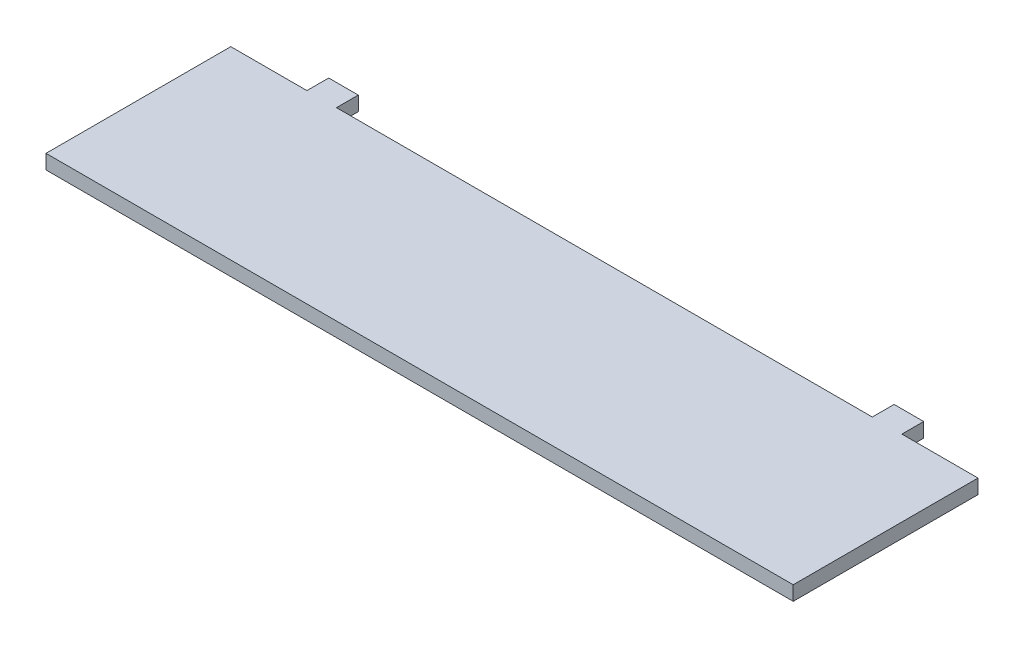
ISO-10303-21;
HEADER;
FILE_DESCRIPTION(('STEP AP214'),'2;1');
FILE_NAME('part.step','',(''),(''),'','','');
FILE_SCHEMA(('AUTOMOTIVE_DESIGN { 1 0 10303 214 1 1 1 1 }'));
ENDSEC;
DATA;
#1=APPLICATION_CONTEXT('core data for automotive mechanical design processes');
#2=APPLICATION_PROTOCOL_DEFINITION('international standard','automotive_design',2000,#1);
#3=PRODUCT_CONTEXT('',#1,'mechanical');
#4=PRODUCT('Part','Part','',(#3));
#5=PRODUCT_RELATED_PRODUCT_CATEGORY('part','',(#4));
#6=PRODUCT_DEFINITION_FORMATION('','',#4);
#7=PRODUCT_DEFINITION_CONTEXT('part definition',#1,'design');
#8=PRODUCT_DEFINITION('design','',#6,#7);
#9=PRODUCT_DEFINITION_SHAPE('','',#8);
#10=(LENGTH_UNIT() NAMED_UNIT(*) SI_UNIT(.MILLI.,.METRE.));
#11=(NAMED_UNIT(*) PLANE_ANGLE_UNIT() SI_UNIT($,.RADIAN.));
#12=(NAMED_UNIT(*) SI_UNIT($,.STERADIAN.) SOLID_ANGLE_UNIT());
#13=UNCERTAINTY_MEASURE_WITH_UNIT(LENGTH_MEASURE(1.E-05),#10,'distance_accuracy_value','');
#14=(GEOMETRIC_REPRESENTATION_CONTEXT(3) GLOBAL_UNCERTAINTY_ASSIGNED_CONTEXT((#13)) GLOBAL_UNIT_ASSIGNED_CONTEXT((#10,
#11,#12)) REPRESENTATION_CONTEXT('',''));
#15=CARTESIAN_POINT('',(0.,0.,0.));
#16=DIRECTION('',(0.,0.,1.));
#17=DIRECTION('',(1.,0.,0.));
#18=AXIS2_PLACEMENT_3D('',#15,#16,#17);
#19=CARTESIAN_POINT('',(-41.9913654357402,1.95,-16.3783260483283));
#20=DIRECTION('',(0.,0.,1.));
#21=DIRECTION('',(1.,0.,0.));
#22=AXIS2_PLACEMENT_3D('',#19,#20,#21);
#23=PLANE('',#22);
#24=DIRECTION('',(0.,1.,0.));
#25=VECTOR('',#24,1.);
#26=CARTESIAN_POINT('',(44.8021345642598,0.,-16.3783260483283));
#27=LINE('',#26,#25);
#28=CARTESIAN_POINT('',(44.8021345642598,0.,-16.3783260483283));
#29=VERTEX_POINT('',#28);
#30=CARTESIAN_POINT('',(44.8021345642598,1.95,-16.3783260483283));
#31=VERTEX_POINT('',#30);
#32=EDGE_CURVE('E155',#29,#31,#27,.T.);
#33=ORIENTED_EDGE('',*,*,#32,.F.);
#34=DIRECTION('',(-1.,0.,0.));
#35=VECTOR('',#34,1.);
#36=CARTESIAN_POINT('',(-41.9913654357402,0.,-16.3783260483283));
#37=LINE('',#36,#35);
#38=CARTESIAN_POINT('',(-27.6937448202683,0.,-16.3783260483283));
#39=VERTEX_POINT('',#38);
#40=EDGE_CURVE('E228',#29,#39,#37,.T.);
#41=ORIENTED_EDGE('',*,*,#40,.T.);
#42=DIRECTION('',(0.,-1.,0.));
#43=VECTOR('',#42,1.);
#44=CARTESIAN_POINT('',(-27.6937448202683,0.,-16.3783260483283));
#45=LINE('',#44,#43);
#46=CARTESIAN_POINT('',(-27.6937448202683,1.95,-16.3783260483283));
#47=VERTEX_POINT('',#46);
#48=EDGE_CURVE('E157',#47,#39,#45,.T.);
#49=ORIENTED_EDGE('',*,*,#48,.F.);
#50=DIRECTION('',(-1.,0.,0.));
#51=VECTOR('',#50,1.);
#52=CARTESIAN_POINT('',(-41.9913654357402,1.95,-16.3783260483283));
#53=LINE('',#52,#51);
#54=EDGE_CURVE('E55',#31,#47,#53,.T.);
#55=ORIENTED_EDGE('',*,*,#54,.F.);
#56=EDGE_LOOP('',(#33,#41,#49,#55));
#57=FACE_BOUND('',#56,.T.);
#58=ADVANCED_FACE('F39',(#57),#23,.F.);
#59=DIRECTION('',(0.,-1.,0.));
#60=VECTOR('',#59,1.);
#61=CARTESIAN_POINT('',(48.8021345642598,0.,-16.3783260483283));
#62=LINE('',#61,#60);
#63=CARTESIAN_POINT('',(48.8021345642598,1.95,-16.3783260483283));
#64=VERTEX_POINT('',#63);
#65=CARTESIAN_POINT('',(48.8021345642598,0.,-16.3783260483283));
#66=VERTEX_POINT('',#65);
#67=EDGE_CURVE('E63',#64,#66,#62,.T.);
#68=ORIENTED_EDGE('',*,*,#67,.F.);
#69=CARTESIAN_POINT('',(59.1006345642598,1.95,-16.3783260483283));
#70=VERTEX_POINT('',#69);
#71=EDGE_CURVE('E212',#70,#64,#53,.T.);
#72=ORIENTED_EDGE('',*,*,#71,.F.);
#73=DIRECTION('',(0.,-1.,0.));
#74=VECTOR('',#73,1.);
#75=CARTESIAN_POINT('',(59.1006345642598,1.95,-16.3783260483283));
#76=LINE('',#75,#74);
#77=CARTESIAN_POINT('',(59.1006345642598,0.,-16.3783260483283));
#78=VERTEX_POINT('',#77);
#79=EDGE_CURVE('E232',#70,#78,#76,.T.);
#80=ORIENTED_EDGE('',*,*,#79,.T.);
#81=EDGE_CURVE('E205',#78,#66,#37,.T.);
#82=ORIENTED_EDGE('',*,*,#81,.T.);
#83=EDGE_LOOP('',(#68,#72,#80,#82));
#84=FACE_BOUND('',#83,.T.);
#85=ADVANCED_FACE('F250',(#84),#23,.F.);
#86=DIRECTION('',(0.,1.,0.));
#87=VECTOR('',#86,1.);
#88=CARTESIAN_POINT('',(-31.6937448202683,0.,-16.3783260483283));
#89=LINE('',#88,#87);
#90=CARTESIAN_POINT('',(-31.6937448202683,0.,-16.3783260483283));
#91=VERTEX_POINT('',#90);
#92=CARTESIAN_POINT('',(-31.6937448202683,1.95,-16.3783260483283));
#93=VERTEX_POINT('',#92);
#94=EDGE_CURVE('E162',#91,#93,#89,.T.);
#95=ORIENTED_EDGE('',*,*,#94,.F.);
#96=CARTESIAN_POINT('',(-41.9913654357402,0.,-16.3783260483283));
#97=VERTEX_POINT('',#96);
#98=EDGE_CURVE('E225',#91,#97,#37,.T.);
#99=ORIENTED_EDGE('',*,*,#98,.T.);
#100=DIRECTION('',(0.,-1.,0.));
#101=VECTOR('',#100,1.);
#102=CARTESIAN_POINT('',(-41.9913654357402,1.95,-16.3783260483283));
#103=LINE('',#102,#101);
#104=CARTESIAN_POINT('',(-41.9913654357402,1.95,-16.3783260483283));
#105=VERTEX_POINT('',#104);
#106=EDGE_CURVE('E215',#105,#97,#103,.T.);
#107=ORIENTED_EDGE('',*,*,#106,.F.);
#108=EDGE_CURVE('E211',#93,#105,#53,.T.);
#109=ORIENTED_EDGE('',*,*,#108,.F.);
#110=EDGE_LOOP('',(#95,#99,#107,#109));
#111=FACE_BOUND('',#110,.T.);
#112=ADVANCED_FACE('F269',(#111),#23,.F.);
#113=CARTESIAN_POINT('',(-41.9913654357402,1.95,-16.3783260483283));
#114=DIRECTION('',(1.,0.,0.));
#115=DIRECTION('',(0.,0.,-1.));
#116=AXIS2_PLACEMENT_3D('',#113,#114,#115);
#117=PLANE('',#116);
#118=DIRECTION('',(0.,0.,1.));
#119=VECTOR('',#118,1.);
#120=CARTESIAN_POINT('',(-41.9913654357402,0.,-16.3783260483283));
#121=LINE('',#120,#119);
#122=CARTESIAN_POINT('',(-41.9913654357402,0.,8.62167395167169));
#123=VERTEX_POINT('',#122);
#124=EDGE_CURVE('E200',#97,#123,#121,.T.);
#125=ORIENTED_EDGE('',*,*,#124,.T.);
#126=DIRECTION('',(0.,-1.,0.));
#127=VECTOR('',#126,1.);
#128=CARTESIAN_POINT('',(-41.9913654357402,1.95,8.62167395167169));
#129=LINE('',#128,#127);
#130=CARTESIAN_POINT('',(-41.9913654357402,1.95,8.62167395167169));
#131=VERTEX_POINT('',#130);
#132=EDGE_CURVE('E11',#131,#123,#129,.T.);
#133=ORIENTED_EDGE('',*,*,#132,.F.);
#134=DIRECTION('',(0.,0.,1.));
#135=VECTOR('',#134,1.);
#136=CARTESIAN_POINT('',(-41.9913654357402,1.95,-16.3783260483283));
#137=LINE('',#136,#135);
#138=EDGE_CURVE('E201',#105,#131,#137,.T.);
#139=ORIENTED_EDGE('',*,*,#138,.F.);
#140=ORIENTED_EDGE('',*,*,#106,.T.);
#141=EDGE_LOOP('',(#125,#133,#139,#140));
#142=FACE_BOUND('',#141,.T.);
#143=ADVANCED_FACE('F41',(#142),#117,.F.);
#144=CARTESIAN_POINT('',(-41.9913654357402,1.95,8.62167395167169));
#145=DIRECTION('',(0.,0.,-1.));
#146=DIRECTION('',(-1.,0.,0.));
#147=AXIS2_PLACEMENT_3D('',#144,#145,#146);
#148=PLANE('',#147);
#149=DIRECTION('',(1.,0.,0.));
#150=VECTOR('',#149,1.);
#151=CARTESIAN_POINT('',(-41.9913654357402,0.,8.62167395167169));
#152=LINE('',#151,#150);
#153=CARTESIAN_POINT('',(59.1006345642598,0.,8.62167395167168));
#154=VERTEX_POINT('',#153);
#155=EDGE_CURVE('E219',#123,#154,#152,.T.);
#156=ORIENTED_EDGE('',*,*,#155,.T.);
#157=DIRECTION('',(0.,-1.,0.));
#158=VECTOR('',#157,1.);
#159=CARTESIAN_POINT('',(59.1006345642598,1.95,8.62167395167168));
#160=LINE('',#159,#158);
#161=CARTESIAN_POINT('',(59.1006345642598,1.95,8.62167395167168));
#162=VERTEX_POINT('',#161);
#163=EDGE_CURVE('E48',#162,#154,#160,.T.);
#164=ORIENTED_EDGE('',*,*,#163,.F.);
#165=DIRECTION('',(1.,0.,0.));
#166=VECTOR('',#165,1.);
#167=CARTESIAN_POINT('',(-41.9913654357402,1.95,8.62167395167169));
#168=LINE('',#167,#166);
#169=EDGE_CURVE('E204',#131,#162,#168,.T.);
#170=ORIENTED_EDGE('',*,*,#169,.F.);
#171=ORIENTED_EDGE('',*,*,#132,.T.);
#172=EDGE_LOOP('',(#156,#164,#170,#171));
#173=FACE_BOUND('',#172,.T.);
#174=ADVANCED_FACE('F280',(#173),#148,.F.);
#175=CARTESIAN_POINT('',(59.1006345642598,1.95,-16.3783260483283));
#176=DIRECTION('',(-1.,0.,0.));
#177=DIRECTION('',(0.,0.,1.));
#178=AXIS2_PLACEMENT_3D('',#175,#176,#177);
#179=PLANE('',#178);
#180=DIRECTION('',(0.,0.,-1.));
#181=VECTOR('',#180,1.);
#182=CARTESIAN_POINT('',(59.1006345642598,0.,-16.3783260483283));
#183=LINE('',#182,#181);
#184=EDGE_CURVE('E222',#154,#78,#183,.T.);
#185=ORIENTED_EDGE('',*,*,#184,.T.);
#186=ORIENTED_EDGE('',*,*,#79,.F.);
#187=DIRECTION('',(0.,0.,-1.));
#188=VECTOR('',#187,1.);
#189=CARTESIAN_POINT('',(59.1006345642598,1.95,-16.3783260483283));
#190=LINE('',#189,#188);
#191=EDGE_CURVE('E208',#162,#70,#190,.T.);
#192=ORIENTED_EDGE('',*,*,#191,.F.);
#193=ORIENTED_EDGE('',*,*,#163,.T.);
#194=EDGE_LOOP('',(#185,#186,#192,#193));
#195=FACE_BOUND('',#194,.T.);
#196=ADVANCED_FACE('F241',(#195),#179,.F.);
#197=CARTESIAN_POINT('',(0.,1.95,0.));
#198=DIRECTION('',(0.,1.,0.));
#199=DIRECTION('',(0.,0.,1.));
#200=AXIS2_PLACEMENT_3D('',#197,#198,#199);
#201=PLANE('',#200);
#202=ORIENTED_EDGE('',*,*,#138,.T.);
#203=ORIENTED_EDGE('',*,*,#169,.T.);
#204=ORIENTED_EDGE('',*,*,#191,.T.);
#205=ORIENTED_EDGE('',*,*,#71,.T.);
#206=DIRECTION('',(0.,0.,1.));
#207=VECTOR('',#206,1.);
#208=CARTESIAN_POINT('',(48.8021345642598,1.95,-19.3283260483283));
#209=LINE('',#208,#207);
#210=CARTESIAN_POINT('',(48.8021345642598,1.95,-19.3283260483283));
#211=VERTEX_POINT('',#210);
#212=EDGE_CURVE('E138',#211,#64,#209,.T.);
#213=ORIENTED_EDGE('',*,*,#212,.F.);
#214=DIRECTION('',(1.,0.,0.));
#215=VECTOR('',#214,1.);
#216=CARTESIAN_POINT('',(44.8021345642598,1.95,-19.3283260483283));
#217=LINE('',#216,#215);
#218=CARTESIAN_POINT('',(44.8021345642598,1.95,-19.3283260483283));
#219=VERTEX_POINT('',#218);
#220=EDGE_CURVE('E130',#219,#211,#217,.T.);
#221=ORIENTED_EDGE('',*,*,#220,.F.);
#222=DIRECTION('',(0.,0.,1.));
#223=VECTOR('',#222,1.);
#224=CARTESIAN_POINT('',(44.8021345642598,1.95,-19.3283260483283));
#225=LINE('',#224,#223);
#226=EDGE_CURVE('E135',#219,#31,#225,.T.);
#227=ORIENTED_EDGE('',*,*,#226,.T.);
#228=ORIENTED_EDGE('',*,*,#54,.T.);
#229=DIRECTION('',(0.,0.,1.));
#230=VECTOR('',#229,1.);
#231=CARTESIAN_POINT('',(-27.6937448202683,1.95,-19.3283260483283));
#232=LINE('',#231,#230);
#233=CARTESIAN_POINT('',(-27.6937448202683,1.95,-19.3283260483283));
#234=VERTEX_POINT('',#233);
#235=EDGE_CURVE('E180',#234,#47,#232,.T.);
#236=ORIENTED_EDGE('',*,*,#235,.F.);
#237=DIRECTION('',(1.,0.,0.));
#238=VECTOR('',#237,1.);
#239=CARTESIAN_POINT('',(-27.6937448202683,1.95,-19.3283260483283));
#240=LINE('',#239,#238);
#241=CARTESIAN_POINT('',(-31.6937448202683,1.95,-19.3283260483283));
#242=VERTEX_POINT('',#241);
#243=EDGE_CURVE('E178',#242,#234,#240,.T.);
#244=ORIENTED_EDGE('',*,*,#243,.F.);
#245=DIRECTION('',(0.,0.,1.));
#246=VECTOR('',#245,1.);
#247=CARTESIAN_POINT('',(-31.6937448202683,1.95,-19.3283260483283));
#248=LINE('',#247,#246);
#249=EDGE_CURVE('E188',#242,#93,#248,.T.);
#250=ORIENTED_EDGE('',*,*,#249,.T.);
#251=ORIENTED_EDGE('',*,*,#108,.T.);
#252=EDGE_LOOP('',(#202,#203,#204,#205,#213,#221,#227,#228,#236,#244,#250,#251));
#253=FACE_BOUND('',#252,.T.);
#254=ADVANCED_FACE('F133',(#253),#201,.T.);
#255=CARTESIAN_POINT('',(0.,0.,0.));
#256=DIRECTION('',(0.,1.,0.));
#257=DIRECTION('',(0.,0.,1.));
#258=AXIS2_PLACEMENT_3D('',#255,#256,#257);
#259=PLANE('',#258);
#260=ORIENTED_EDGE('',*,*,#124,.F.);
#261=ORIENTED_EDGE('',*,*,#98,.F.);
#262=DIRECTION('',(0.,0.,1.));
#263=VECTOR('',#262,1.);
#264=CARTESIAN_POINT('',(-31.6937448202683,0.,-19.3283260483283));
#265=LINE('',#264,#263);
#266=CARTESIAN_POINT('',(-31.6937448202683,0.,-19.3283260483283));
#267=VERTEX_POINT('',#266);
#268=EDGE_CURVE('E192',#267,#91,#265,.T.);
#269=ORIENTED_EDGE('',*,*,#268,.F.);
#270=DIRECTION('',(-1.,0.,0.));
#271=VECTOR('',#270,1.);
#272=CARTESIAN_POINT('',(-27.6937448202683,0.,-19.3283260483283));
#273=LINE('',#272,#271);
#274=CARTESIAN_POINT('',(-27.6937448202683,0.,-19.3283260483283));
#275=VERTEX_POINT('',#274);
#276=EDGE_CURVE('E172',#275,#267,#273,.T.);
#277=ORIENTED_EDGE('',*,*,#276,.F.);
#278=DIRECTION('',(0.,0.,1.));
#279=VECTOR('',#278,1.);
#280=CARTESIAN_POINT('',(-27.6937448202683,0.,-19.3283260483283));
#281=LINE('',#280,#279);
#282=EDGE_CURVE('E196',#275,#39,#281,.T.);
#283=ORIENTED_EDGE('',*,*,#282,.T.);
#284=ORIENTED_EDGE('',*,*,#40,.F.);
#285=DIRECTION('',(0.,0.,1.));
#286=VECTOR('',#285,1.);
#287=CARTESIAN_POINT('',(44.8021345642598,0.,-19.3283260483283));
#288=LINE('',#287,#286);
#289=CARTESIAN_POINT('',(44.8021345642598,0.,-19.3283260483283));
#290=VERTEX_POINT('',#289);
#291=EDGE_CURVE('E259',#290,#29,#288,.T.);
#292=ORIENTED_EDGE('',*,*,#291,.F.);
#293=DIRECTION('',(-1.,0.,0.));
#294=VECTOR('',#293,1.);
#295=CARTESIAN_POINT('',(44.8021345642598,0.,-19.3283260483283));
#296=LINE('',#295,#294);
#297=CARTESIAN_POINT('',(48.8021345642598,0.,-19.3283260483283));
#298=VERTEX_POINT('',#297);
#299=EDGE_CURVE('E148',#298,#290,#296,.T.);
#300=ORIENTED_EDGE('',*,*,#299,.F.);
#301=DIRECTION('',(0.,0.,1.));
#302=VECTOR('',#301,1.);
#303=CARTESIAN_POINT('',(48.8021345642598,0.,-19.3283260483283));
#304=LINE('',#303,#302);
#305=EDGE_CURVE('E164',#298,#66,#304,.T.);
#306=ORIENTED_EDGE('',*,*,#305,.T.);
#307=ORIENTED_EDGE('',*,*,#81,.F.);
#308=ORIENTED_EDGE('',*,*,#184,.F.);
#309=ORIENTED_EDGE('',*,*,#155,.F.);
#310=EDGE_LOOP('',(#260,#261,#269,#277,#283,#284,#292,#300,#306,#307,#308,#309));
#311=FACE_BOUND('',#310,.T.);
#312=ADVANCED_FACE('F247',(#311),#259,.F.);
#313=CARTESIAN_POINT('',(-27.6937448202683,0.,-19.3283260483283));
#314=DIRECTION('',(-1.,0.,0.));
#315=DIRECTION('',(0.,-1.,0.));
#316=AXIS2_PLACEMENT_3D('',#313,#314,#315);
#317=PLANE('',#316);
#318=ORIENTED_EDGE('',*,*,#48,.T.);
#319=ORIENTED_EDGE('',*,*,#282,.F.);
#320=DIRECTION('',(0.,-1.,0.));
#321=VECTOR('',#320,1.);
#322=CARTESIAN_POINT('',(-27.6937448202683,0.,-19.3283260483283));
#323=LINE('',#322,#321);
#324=EDGE_CURVE('E168',#234,#275,#323,.T.);
#325=ORIENTED_EDGE('',*,*,#324,.F.);
#326=ORIENTED_EDGE('',*,*,#235,.T.);
#327=EDGE_LOOP('',(#318,#319,#325,#326));
#328=FACE_BOUND('',#327,.T.);
#329=ADVANCED_FACE('F296',(#328),#317,.F.);
#330=CARTESIAN_POINT('',(-31.6937448202683,0.,-19.3283260483283));
#331=DIRECTION('',(1.,0.,0.));
#332=DIRECTION('',(0.,0.,-1.));
#333=AXIS2_PLACEMENT_3D('',#330,#331,#332);
#334=PLANE('',#333);
#335=ORIENTED_EDGE('',*,*,#94,.T.);
#336=ORIENTED_EDGE('',*,*,#249,.F.);
#337=DIRECTION('',(0.,1.,0.));
#338=VECTOR('',#337,1.);
#339=CARTESIAN_POINT('',(-31.6937448202683,0.,-19.3283260483283));
#340=LINE('',#339,#338);
#341=EDGE_CURVE('E175',#267,#242,#340,.T.);
#342=ORIENTED_EDGE('',*,*,#341,.F.);
#343=ORIENTED_EDGE('',*,*,#268,.T.);
#344=EDGE_LOOP('',(#335,#336,#342,#343));
#345=FACE_BOUND('',#344,.T.);
#346=ADVANCED_FACE('F289',(#345),#334,.F.);
#347=CARTESIAN_POINT('',(0.,0.,-19.3283260483283));
#348=DIRECTION('',(0.,0.,1.));
#349=DIRECTION('',(1.,0.,0.));
#350=AXIS2_PLACEMENT_3D('',#347,#348,#349);
#351=PLANE('',#350);
#352=ORIENTED_EDGE('',*,*,#324,.T.);
#353=ORIENTED_EDGE('',*,*,#276,.T.);
#354=ORIENTED_EDGE('',*,*,#341,.T.);
#355=ORIENTED_EDGE('',*,*,#243,.T.);
#356=EDGE_LOOP('',(#352,#353,#354,#355));
#357=FACE_BOUND('',#356,.T.);
#358=ADVANCED_FACE('F292',(#357),#351,.F.);
#359=CARTESIAN_POINT('',(44.8021345642598,0.,-19.3283260483283));
#360=DIRECTION('',(1.,0.,0.));
#361=DIRECTION('',(0.,0.,-1.));
#362=AXIS2_PLACEMENT_3D('',#359,#360,#361);
#363=PLANE('',#362);
#364=ORIENTED_EDGE('',*,*,#32,.T.);
#365=ORIENTED_EDGE('',*,*,#226,.F.);
#366=DIRECTION('',(0.,1.,0.));
#367=VECTOR('',#366,1.);
#368=CARTESIAN_POINT('',(44.8021345642598,0.,-19.3283260483283));
#369=LINE('',#368,#367);
#370=EDGE_CURVE('E143',#290,#219,#369,.T.);
#371=ORIENTED_EDGE('',*,*,#370,.F.);
#372=ORIENTED_EDGE('',*,*,#291,.T.);
#373=EDGE_LOOP('',(#364,#365,#371,#372));
#374=FACE_BOUND('',#373,.T.);
#375=ADVANCED_FACE('F154',(#374),#363,.F.);
#376=CARTESIAN_POINT('',(48.8021345642598,0.,-19.3283260483283));
#377=DIRECTION('',(-1.,0.,0.));
#378=DIRECTION('',(0.,0.,1.));
#379=AXIS2_PLACEMENT_3D('',#376,#377,#378);
#380=PLANE('',#379);
#381=ORIENTED_EDGE('',*,*,#67,.T.);
#382=ORIENTED_EDGE('',*,*,#305,.F.);
#383=DIRECTION('',(0.,-1.,0.));
#384=VECTOR('',#383,1.);
#385=CARTESIAN_POINT('',(48.8021345642598,0.,-19.3283260483283));
#386=LINE('',#385,#384);
#387=EDGE_CURVE('E142',#211,#298,#386,.T.);
#388=ORIENTED_EDGE('',*,*,#387,.F.);
#389=ORIENTED_EDGE('',*,*,#212,.T.);
#390=EDGE_LOOP('',(#381,#382,#388,#389));
#391=FACE_BOUND('',#390,.T.);
#392=ADVANCED_FACE('F252',(#391),#380,.F.);
#393=CARTESIAN_POINT('',(0.,0.,-19.3283260483283));
#394=DIRECTION('',(0.,0.,-1.));
#395=DIRECTION('',(-1.,0.,0.));
#396=AXIS2_PLACEMENT_3D('',#393,#394,#395);
#397=PLANE('',#396);
#398=ORIENTED_EDGE('',*,*,#370,.T.);
#399=ORIENTED_EDGE('',*,*,#220,.T.);
#400=ORIENTED_EDGE('',*,*,#387,.T.);
#401=ORIENTED_EDGE('',*,*,#299,.T.);
#402=EDGE_LOOP('',(#398,#399,#400,#401));
#403=FACE_BOUND('',#402,.T.);
#404=ADVANCED_FACE('F146',(#403),#397,.T.);
#405=CLOSED_SHELL('',(#58,#85,#112,#143,#174,#196,#254,#312,#329,#346,#358,#375,#392,#404));
#406=MANIFOLD_SOLID_BREP('B2',#405);
#407=ADVANCED_BREP_SHAPE_REPRESENTATION('',(#18,#406),#14);
#408=SHAPE_DEFINITION_REPRESENTATION(#9,#407);
ENDSEC;
END-ISO-10303-21;
